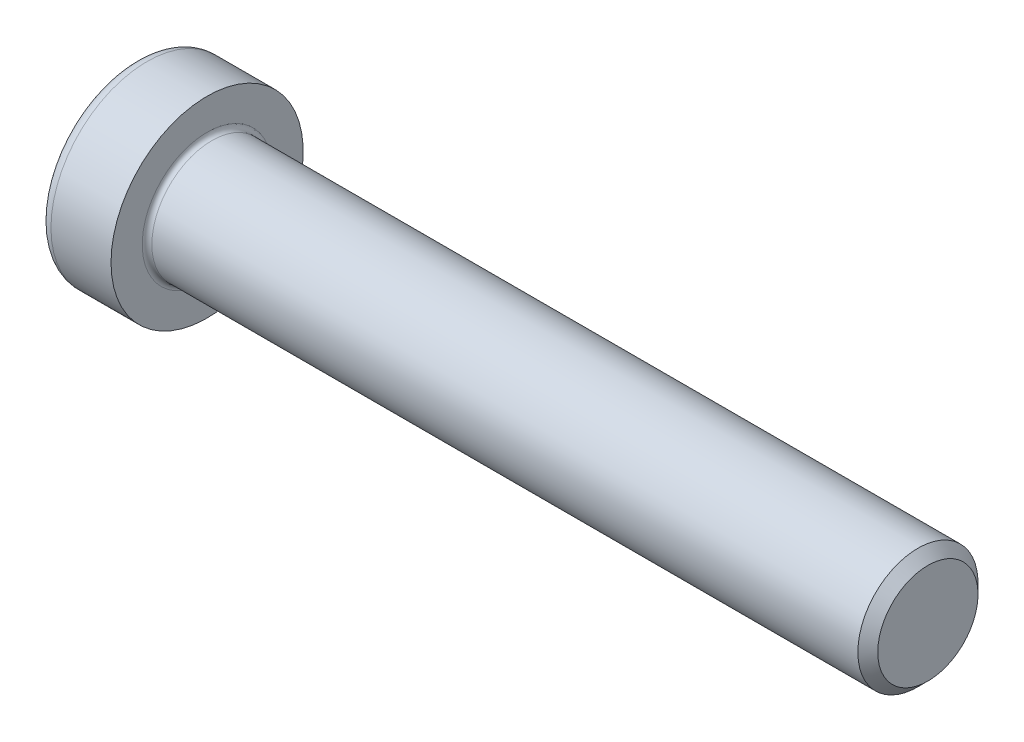
ISO-10303-21;
HEADER;
FILE_DESCRIPTION(('STEP AP214'),'2;1');
FILE_NAME('part.step','',(''),(''),'','','');
FILE_SCHEMA(('AUTOMOTIVE_DESIGN { 1 0 10303 214 1 1 1 1 }'));
ENDSEC;
DATA;
#1=APPLICATION_CONTEXT('core data for automotive mechanical design processes');
#2=APPLICATION_PROTOCOL_DEFINITION('international standard','automotive_design',2000,#1);
#3=PRODUCT_CONTEXT('',#1,'mechanical');
#4=PRODUCT('Part','Part','',(#3));
#5=PRODUCT_RELATED_PRODUCT_CATEGORY('part','',(#4));
#6=PRODUCT_DEFINITION_FORMATION('','',#4);
#7=PRODUCT_DEFINITION_CONTEXT('part definition',#1,'design');
#8=PRODUCT_DEFINITION('design','',#6,#7);
#9=PRODUCT_DEFINITION_SHAPE('','',#8);
#10=(LENGTH_UNIT() NAMED_UNIT(*) SI_UNIT(.MILLI.,.METRE.));
#11=(NAMED_UNIT(*) PLANE_ANGLE_UNIT() SI_UNIT($,.RADIAN.));
#12=(NAMED_UNIT(*) SI_UNIT($,.STERADIAN.) SOLID_ANGLE_UNIT());
#13=UNCERTAINTY_MEASURE_WITH_UNIT(LENGTH_MEASURE(1.E-05),#10,'distance_accuracy_value','');
#14=(GEOMETRIC_REPRESENTATION_CONTEXT(3) GLOBAL_UNCERTAINTY_ASSIGNED_CONTEXT((#13)) GLOBAL_UNIT_ASSIGNED_CONTEXT((#10,
#11,#12)) REPRESENTATION_CONTEXT('',''));
#15=CARTESIAN_POINT('',(0.,0.,0.));
#16=DIRECTION('',(0.,0.,1.));
#17=DIRECTION('',(1.,0.,0.));
#18=AXIS2_PLACEMENT_3D('',#15,#16,#17);
#19=CARTESIAN_POINT('',(0.,0.,0.));
#20=DIRECTION('',(-1.,0.,0.));
#21=DIRECTION('',(0.,0.,1.));
#22=AXIS2_PLACEMENT_3D('',#19,#20,#21);
#23=PLANE('',#22);
#24=DIRECTION('',(0.,-0.499999999999997,0.86602540378444));
#25=VECTOR('',#24,1.);
#26=CARTESIAN_POINT('',(0.,4.04145188432738,0.));
#27=LINE('',#26,#25);
#28=CARTESIAN_POINT('',(0.,4.04145188432738,0.));
#29=VERTEX_POINT('',#28);
#30=CARTESIAN_POINT('',(0.,2.0207259421637,3.49999999999999));
#31=VERTEX_POINT('',#30);
#32=EDGE_CURVE('E302',#29,#31,#27,.T.);
#33=ORIENTED_EDGE('',*,*,#32,.T.);
#34=DIRECTION('',(0.,1.,0.));
#35=VECTOR('',#34,1.);
#36=CARTESIAN_POINT('',(0.,-2.02072594216367,3.5));
#37=LINE('',#36,#35);
#38=CARTESIAN_POINT('',(0.,-2.02072594216367,3.5));
#39=VERTEX_POINT('',#38);
#40=EDGE_CURVE('E143',#39,#31,#37,.T.);
#41=ORIENTED_EDGE('',*,*,#40,.F.);
#42=DIRECTION('',(0.,-0.500000000000001,-0.866025403784438));
#43=VECTOR('',#42,1.);
#44=CARTESIAN_POINT('',(0.,-2.02072594216367,3.5));
#45=LINE('',#44,#43);
#46=CARTESIAN_POINT('',(0.,-4.04145188432737,0.));
#47=VERTEX_POINT('',#46);
#48=EDGE_CURVE('E307',#39,#47,#45,.T.);
#49=ORIENTED_EDGE('',*,*,#48,.T.);
#50=DIRECTION('',(0.,0.499999999999997,-0.86602540378444));
#51=VECTOR('',#50,1.);
#52=CARTESIAN_POINT('',(0.,-4.04145188432737,0.));
#53=LINE('',#52,#51);
#54=CARTESIAN_POINT('',(0.,-2.02072594216369,-3.5));
#55=VERTEX_POINT('',#54);
#56=EDGE_CURVE('E311',#47,#55,#53,.T.);
#57=ORIENTED_EDGE('',*,*,#56,.T.);
#58=DIRECTION('',(0.,-1.,0.));
#59=VECTOR('',#58,1.);
#60=CARTESIAN_POINT('',(0.,2.02072594216369,-3.50000000000001));
#61=LINE('',#60,#59);
#62=CARTESIAN_POINT('',(0.,2.02072594216369,-3.50000000000001));
#63=VERTEX_POINT('',#62);
#64=EDGE_CURVE('E315',#63,#55,#61,.T.);
#65=ORIENTED_EDGE('',*,*,#64,.F.);
#66=DIRECTION('',(0.,-0.500000000000001,-0.866025403784438));
#67=VECTOR('',#66,1.);
#68=CARTESIAN_POINT('',(0.,4.04145188432738,0.));
#69=LINE('',#68,#67);
#70=EDGE_CURVE('E138',#29,#63,#69,.T.);
#71=ORIENTED_EDGE('',*,*,#70,.F.);
#72=EDGE_LOOP('',(#33,#41,#49,#57,#65,#71));
#73=FACE_BOUND('',#72,.T.);
#74=CARTESIAN_POINT('',(0.,0.,0.));
#75=DIRECTION('',(-1.,0.,0.));
#76=DIRECTION('',(0.,0.,1.));
#77=AXIS2_PLACEMENT_3D('',#74,#75,#76);
#78=CIRCLE('',#77,7.);
#79=CARTESIAN_POINT('',(0.,0.,7.));
#80=VERTEX_POINT('',#79);
#81=EDGE_CURVE('E57',#80,#80,#78,.T.);
#82=ORIENTED_EDGE('',*,*,#81,.T.);
#83=EDGE_LOOP('',(#82));
#84=FACE_BOUND('',#83,.T.);
#85=ADVANCED_FACE('F48',(#73,#84),#23,.T.);
#86=CARTESIAN_POINT('',(-31.75,0.,0.));
#87=DIRECTION('',(-1.,0.,0.));
#88=DIRECTION('',(0.,0.,1.));
#89=AXIS2_PLACEMENT_3D('',#86,#87,#88);
#90=CYLINDRICAL_SURFACE('',#89,8.);
#91=CARTESIAN_POINT('',(1.,0.,0.));
#92=DIRECTION('',(-1.,0.,0.));
#93=DIRECTION('',(0.,0.,1.));
#94=AXIS2_PLACEMENT_3D('',#91,#92,#93);
#95=CIRCLE('',#94,8.);
#96=CARTESIAN_POINT('',(1.,0.,8.));
#97=VERTEX_POINT('',#96);
#98=EDGE_CURVE('E11',#97,#97,#95,.F.);
#99=ORIENTED_EDGE('',*,*,#98,.T.);
#100=EDGE_LOOP('',(#99));
#101=FACE_BOUND('',#100,.T.);
#102=CARTESIAN_POINT('',(6.,0.,0.));
#103=DIRECTION('',(-1.,0.,0.));
#104=DIRECTION('',(0.,0.,1.));
#105=AXIS2_PLACEMENT_3D('',#102,#103,#104);
#106=CIRCLE('',#105,8.);
#107=CARTESIAN_POINT('',(6.,0.,8.));
#108=VERTEX_POINT('',#107);
#109=EDGE_CURVE('E168',#108,#108,#106,.T.);
#110=ORIENTED_EDGE('',*,*,#109,.T.);
#111=EDGE_LOOP('',(#110));
#112=FACE_BOUND('',#111,.T.);
#113=ADVANCED_FACE('F198',(#101,#112),#90,.T.);
#114=CARTESIAN_POINT('',(6.,8.,0.));
#115=DIRECTION('',(1.,0.,0.));
#116=DIRECTION('',(0.,0.,-1.));
#117=AXIS2_PLACEMENT_3D('',#114,#115,#116);
#118=PLANE('',#117);
#119=CARTESIAN_POINT('',(6.,0.,0.));
#120=DIRECTION('',(1.,0.,0.));
#121=DIRECTION('',(0.,0.,-1.));
#122=AXIS2_PLACEMENT_3D('',#119,#120,#121);
#123=CIRCLE('',#122,5.4);
#124=CARTESIAN_POINT('',(6.,0.,-5.4));
#125=VERTEX_POINT('',#124);
#126=EDGE_CURVE('E172',#125,#125,#123,.F.);
#127=ORIENTED_EDGE('',*,*,#126,.T.);
#128=EDGE_LOOP('',(#127));
#129=FACE_BOUND('',#128,.T.);
#130=ORIENTED_EDGE('',*,*,#109,.F.);
#131=EDGE_LOOP('',(#130));
#132=FACE_BOUND('',#131,.T.);
#133=ADVANCED_FACE('F203',(#129,#132),#118,.T.);
#134=CARTESIAN_POINT('',(-31.75,0.,0.));
#135=DIRECTION('',(-1.,0.,0.));
#136=DIRECTION('',(0.,0.,1.));
#137=AXIS2_PLACEMENT_3D('',#134,#135,#136);
#138=CYLINDRICAL_SURFACE('',#137,5.);
#139=CARTESIAN_POINT('',(6.4,0.,0.));
#140=DIRECTION('',(1.,0.,0.));
#141=DIRECTION('',(0.,0.,-1.));
#142=AXIS2_PLACEMENT_3D('',#139,#140,#141);
#143=CIRCLE('',#142,5.);
#144=CARTESIAN_POINT('',(6.4,0.,-5.));
#145=VERTEX_POINT('',#144);
#146=EDGE_CURVE('E176',#145,#145,#143,.T.);
#147=ORIENTED_EDGE('',*,*,#146,.T.);
#148=EDGE_LOOP('',(#147));
#149=FACE_BOUND('',#148,.T.);
#150=CARTESIAN_POINT('',(65.172,0.,0.));
#151=DIRECTION('',(-1.,0.,0.));
#152=DIRECTION('',(0.,0.,1.));
#153=AXIS2_PLACEMENT_3D('',#150,#151,#152);
#154=CIRCLE('',#153,5.);
#155=CARTESIAN_POINT('',(65.172,0.,5.));
#156=VERTEX_POINT('',#155);
#157=EDGE_CURVE('E164',#156,#156,#154,.T.);
#158=ORIENTED_EDGE('',*,*,#157,.T.);
#159=EDGE_LOOP('',(#158));
#160=FACE_BOUND('',#159,.T.);
#161=ADVANCED_FACE('F209',(#149,#160),#138,.T.);
#162=CARTESIAN_POINT('',(66.,0.,0.));
#163=DIRECTION('',(-1.,0.,0.));
#164=DIRECTION('',(0.,0.,1.));
#165=AXIS2_PLACEMENT_3D('',#162,#163,#164);
#166=CONICAL_SURFACE('',#165,4.172,0.78539816339745);
#167=ORIENTED_EDGE('',*,*,#157,.F.);
#168=EDGE_LOOP('',(#167));
#169=FACE_BOUND('',#168,.T.);
#170=CARTESIAN_POINT('',(66.,0.,0.));
#171=DIRECTION('',(-1.,0.,0.));
#172=DIRECTION('',(0.,0.,1.));
#173=AXIS2_PLACEMENT_3D('',#170,#171,#172);
#174=CIRCLE('',#173,4.172);
#175=CARTESIAN_POINT('',(66.,0.,4.172));
#176=VERTEX_POINT('',#175);
#177=EDGE_CURVE('E159',#176,#176,#174,.T.);
#178=ORIENTED_EDGE('',*,*,#177,.T.);
#179=EDGE_LOOP('',(#178));
#180=FACE_BOUND('',#179,.T.);
#181=ADVANCED_FACE('F213',(#169,#180),#166,.T.);
#182=CARTESIAN_POINT('',(66.,4.172,0.));
#183=DIRECTION('',(1.,0.,0.));
#184=DIRECTION('',(0.,0.,-1.));
#185=AXIS2_PLACEMENT_3D('',#182,#183,#184);
#186=PLANE('',#185);
#187=ORIENTED_EDGE('',*,*,#177,.F.);
#188=EDGE_LOOP('',(#187));
#189=FACE_BOUND('',#188,.T.);
#190=ADVANCED_FACE('F195',(#189),#186,.T.);
#191=CARTESIAN_POINT('',(6.4,0.,0.));
#192=DIRECTION('',(1.,0.,0.));
#193=DIRECTION('',(0.,0.,-1.));
#194=AXIS2_PLACEMENT_3D('',#191,#192,#193);
#195=TOROIDAL_SURFACE('',#194,5.4,0.4);
#196=ORIENTED_EDGE('',*,*,#146,.F.);
#197=EDGE_LOOP('',(#196));
#198=FACE_BOUND('',#197,.T.);
#199=ORIENTED_EDGE('',*,*,#126,.F.);
#200=EDGE_LOOP('',(#199));
#201=FACE_BOUND('',#200,.T.);
#202=ADVANCED_FACE('F186',(#198,#201),#195,.F.);
#203=CARTESIAN_POINT('',(1.,0.,0.));
#204=DIRECTION('',(-1.,0.,0.));
#205=DIRECTION('',(0.,0.,1.));
#206=AXIS2_PLACEMENT_3D('',#203,#204,#205);
#207=TOROIDAL_SURFACE('',#206,7.,1.);
#208=ORIENTED_EDGE('',*,*,#98,.F.);
#209=EDGE_LOOP('',(#208));
#210=FACE_BOUND('',#209,.T.);
#211=ORIENTED_EDGE('',*,*,#81,.F.);
#212=EDGE_LOOP('',(#211));
#213=FACE_BOUND('',#212,.T.);
#214=ADVANCED_FACE('F50',(#210,#213),#207,.T.);
#215=CARTESIAN_POINT('',(4.5,4.04145188432738,0.));
#216=DIRECTION('',(0.,-0.86602540378444,-0.499999999999997));
#217=DIRECTION('',(0.,0.499999999999997,-0.86602540378444));
#218=AXIS2_PLACEMENT_3D('',#215,#216,#217);
#219=PLANE('',#218);
#220=ORIENTED_EDGE('',*,*,#32,.F.);
#221=DIRECTION('',(-1.,0.,0.));
#222=VECTOR('',#221,1.);
#223=CARTESIAN_POINT('',(4.5,4.04145188432738,0.));
#224=LINE('',#223,#222);
#225=CARTESIAN_POINT('',(4.5,4.04145188432738,0.));
#226=VERTEX_POINT('',#225);
#227=EDGE_CURVE('E301',#226,#29,#224,.T.);
#228=ORIENTED_EDGE('',*,*,#227,.F.);
#229=DIRECTION('',(0.,-0.499999999999997,0.86602540378444));
#230=VECTOR('',#229,1.);
#231=CARTESIAN_POINT('',(4.5,4.04145188432738,0.));
#232=LINE('',#231,#230);
#233=CARTESIAN_POINT('',(4.5,3.03108891324554,1.74999999999999));
#234=VERTEX_POINT('',#233);
#235=EDGE_CURVE('E64',#226,#234,#232,.T.);
#236=ORIENTED_EDGE('',*,*,#235,.T.);
#237=CARTESIAN_POINT('',(4.5,2.0207259421637,3.49999999999999));
#238=VERTEX_POINT('',#237);
#239=EDGE_CURVE('E122',#234,#238,#232,.T.);
#240=ORIENTED_EDGE('',*,*,#239,.T.);
#241=DIRECTION('',(-1.,0.,0.));
#242=VECTOR('',#241,1.);
#243=CARTESIAN_POINT('',(4.5,2.0207259421637,3.49999999999999));
#244=LINE('',#243,#242);
#245=EDGE_CURVE('E135',#238,#31,#244,.T.);
#246=ORIENTED_EDGE('',*,*,#245,.T.);
#247=EDGE_LOOP('',(#220,#228,#236,#240,#246));
#248=FACE_BOUND('',#247,.T.);
#249=ADVANCED_FACE('F134',(#248),#219,.T.);
#250=CARTESIAN_POINT('',(4.5,-2.02072594216367,3.5));
#251=DIRECTION('',(0.,0.,1.));
#252=DIRECTION('',(0.,-1.,0.));
#253=AXIS2_PLACEMENT_3D('',#250,#251,#252);
#254=PLANE('',#253);
#255=ORIENTED_EDGE('',*,*,#40,.T.);
#256=ORIENTED_EDGE('',*,*,#245,.F.);
#257=DIRECTION('',(0.,1.,0.));
#258=VECTOR('',#257,1.);
#259=CARTESIAN_POINT('',(4.5,-2.02072594216367,3.5));
#260=LINE('',#259,#258);
#261=CARTESIAN_POINT('',(4.5,0.,3.49999999999999));
#262=VERTEX_POINT('',#261);
#263=EDGE_CURVE('E120',#262,#238,#260,.T.);
#264=ORIENTED_EDGE('',*,*,#263,.F.);
#265=CARTESIAN_POINT('',(4.5,-2.02072594216367,3.5));
#266=VERTEX_POINT('',#265);
#267=EDGE_CURVE('E131',#266,#262,#260,.T.);
#268=ORIENTED_EDGE('',*,*,#267,.F.);
#269=DIRECTION('',(-1.,0.,0.));
#270=VECTOR('',#269,1.);
#271=CARTESIAN_POINT('',(4.5,-2.02072594216367,3.5));
#272=LINE('',#271,#270);
#273=EDGE_CURVE('E146',#266,#39,#272,.T.);
#274=ORIENTED_EDGE('',*,*,#273,.T.);
#275=EDGE_LOOP('',(#255,#256,#264,#268,#274));
#276=FACE_BOUND('',#275,.T.);
#277=ADVANCED_FACE('F140',(#276),#254,.F.);
#278=CARTESIAN_POINT('',(4.5,-2.02072594216367,3.5));
#279=DIRECTION('',(0.,0.866025403784438,-0.500000000000001));
#280=DIRECTION('',(0.,0.500000000000001,0.866025403784438));
#281=AXIS2_PLACEMENT_3D('',#278,#279,#280);
#282=PLANE('',#281);
#283=ORIENTED_EDGE('',*,*,#48,.F.);
#284=ORIENTED_EDGE('',*,*,#273,.F.);
#285=DIRECTION('',(0.,-0.500000000000001,-0.866025403784438));
#286=VECTOR('',#285,1.);
#287=CARTESIAN_POINT('',(4.5,-2.02072594216367,3.5));
#288=LINE('',#287,#286);
#289=CARTESIAN_POINT('',(4.5,-3.03108891324552,1.75));
#290=VERTEX_POINT('',#289);
#291=EDGE_CURVE('E275',#266,#290,#288,.T.);
#292=ORIENTED_EDGE('',*,*,#291,.T.);
#293=CARTESIAN_POINT('',(4.5,-4.04145188432737,0.));
#294=VERTEX_POINT('',#293);
#295=EDGE_CURVE('E277',#290,#294,#288,.T.);
#296=ORIENTED_EDGE('',*,*,#295,.T.);
#297=DIRECTION('',(-1.,0.,0.));
#298=VECTOR('',#297,1.);
#299=CARTESIAN_POINT('',(4.5,-4.04145188432737,0.));
#300=LINE('',#299,#298);
#301=EDGE_CURVE('E154',#294,#47,#300,.T.);
#302=ORIENTED_EDGE('',*,*,#301,.T.);
#303=EDGE_LOOP('',(#283,#284,#292,#296,#302));
#304=FACE_BOUND('',#303,.T.);
#305=ADVANCED_FACE('F226',(#304),#282,.T.);
#306=CARTESIAN_POINT('',(4.5,-4.04145188432737,0.));
#307=DIRECTION('',(0.,0.86602540378444,0.499999999999997));
#308=DIRECTION('',(0.,-0.499999999999998,0.86602540378444));
#309=AXIS2_PLACEMENT_3D('',#306,#307,#308);
#310=PLANE('',#309);
#311=ORIENTED_EDGE('',*,*,#56,.F.);
#312=ORIENTED_EDGE('',*,*,#301,.F.);
#313=DIRECTION('',(0.,0.499999999999997,-0.86602540378444));
#314=VECTOR('',#313,1.);
#315=CARTESIAN_POINT('',(4.5,-4.04145188432737,0.));
#316=LINE('',#315,#314);
#317=CARTESIAN_POINT('',(4.5,-3.03108891324554,-1.74999999999999));
#318=VERTEX_POINT('',#317);
#319=EDGE_CURVE('E280',#294,#318,#316,.T.);
#320=ORIENTED_EDGE('',*,*,#319,.T.);
#321=CARTESIAN_POINT('',(4.5,-2.02072594216369,-3.5));
#322=VERTEX_POINT('',#321);
#323=EDGE_CURVE('E286',#318,#322,#316,.T.);
#324=ORIENTED_EDGE('',*,*,#323,.T.);
#325=DIRECTION('',(-1.,0.,0.));
#326=VECTOR('',#325,1.);
#327=CARTESIAN_POINT('',(4.5,-2.02072594216369,-3.5));
#328=LINE('',#327,#326);
#329=EDGE_CURVE('E328',#322,#55,#328,.T.);
#330=ORIENTED_EDGE('',*,*,#329,.T.);
#331=EDGE_LOOP('',(#311,#312,#320,#324,#330));
#332=FACE_BOUND('',#331,.T.);
#333=ADVANCED_FACE('F229',(#332),#310,.T.);
#334=CARTESIAN_POINT('',(4.5,2.02072594216369,-3.50000000000001));
#335=DIRECTION('',(0.,0.,-1.));
#336=DIRECTION('',(0.,1.,0.));
#337=AXIS2_PLACEMENT_3D('',#334,#335,#336);
#338=PLANE('',#337);
#339=ORIENTED_EDGE('',*,*,#64,.T.);
#340=ORIENTED_EDGE('',*,*,#329,.F.);
#341=DIRECTION('',(0.,-1.,0.));
#342=VECTOR('',#341,1.);
#343=CARTESIAN_POINT('',(4.5,2.02072594216369,-3.50000000000001));
#344=LINE('',#343,#342);
#345=CARTESIAN_POINT('',(4.5,0.,-3.5));
#346=VERTEX_POINT('',#345);
#347=EDGE_CURVE('E293',#346,#322,#344,.T.);
#348=ORIENTED_EDGE('',*,*,#347,.F.);
#349=CARTESIAN_POINT('',(4.5,2.02072594216369,-3.50000000000001));
#350=VERTEX_POINT('',#349);
#351=EDGE_CURVE('E294',#350,#346,#344,.T.);
#352=ORIENTED_EDGE('',*,*,#351,.F.);
#353=DIRECTION('',(-1.,0.,0.));
#354=VECTOR('',#353,1.);
#355=CARTESIAN_POINT('',(4.5,2.02072594216369,-3.50000000000001));
#356=LINE('',#355,#354);
#357=EDGE_CURVE('E324',#350,#63,#356,.T.);
#358=ORIENTED_EDGE('',*,*,#357,.T.);
#359=EDGE_LOOP('',(#339,#340,#348,#352,#358));
#360=FACE_BOUND('',#359,.T.);
#361=ADVANCED_FACE('F233',(#360),#338,.F.);
#362=CARTESIAN_POINT('',(4.5,4.04145188432738,0.));
#363=DIRECTION('',(0.,0.866025403784438,-0.500000000000001));
#364=DIRECTION('',(0.,0.500000000000001,0.866025403784438));
#365=AXIS2_PLACEMENT_3D('',#362,#363,#364);
#366=PLANE('',#365);
#367=ORIENTED_EDGE('',*,*,#70,.T.);
#368=ORIENTED_EDGE('',*,*,#357,.F.);
#369=DIRECTION('',(0.,-0.500000000000001,-0.866025403784438));
#370=VECTOR('',#369,1.);
#371=CARTESIAN_POINT('',(4.5,4.04145188432738,0.));
#372=LINE('',#371,#370);
#373=CARTESIAN_POINT('',(4.5,3.03108891324554,-1.75000000000001));
#374=VERTEX_POINT('',#373);
#375=EDGE_CURVE('E298',#374,#350,#372,.T.);
#376=ORIENTED_EDGE('',*,*,#375,.F.);
#377=EDGE_CURVE('E265',#226,#374,#372,.T.);
#378=ORIENTED_EDGE('',*,*,#377,.F.);
#379=ORIENTED_EDGE('',*,*,#227,.T.);
#380=EDGE_LOOP('',(#367,#368,#376,#378,#379));
#381=FACE_BOUND('',#380,.T.);
#382=ADVANCED_FACE('F237',(#381),#366,.F.);
#383=CARTESIAN_POINT('',(4.5,2.0207259421637,3.49999999999999));
#384=DIRECTION('',(-1.,0.,0.));
#385=DIRECTION('',(0.,0.,1.));
#386=AXIS2_PLACEMENT_3D('',#383,#384,#385);
#387=PLANE('',#386);
#388=CARTESIAN_POINT('',(4.5,0.,0.));
#389=DIRECTION('',(-1.,0.,0.));
#390=DIRECTION('',(0.,0.,1.));
#391=AXIS2_PLACEMENT_3D('',#388,#389,#390);
#392=CIRCLE('',#391,3.5);
#393=EDGE_CURVE('E145',#290,#262,#392,.T.);
#394=ORIENTED_EDGE('',*,*,#393,.F.);
#395=ORIENTED_EDGE('',*,*,#291,.F.);
#396=ORIENTED_EDGE('',*,*,#267,.T.);
#397=EDGE_LOOP('',(#394,#395,#396));
#398=FACE_BOUND('',#397,.T.);
#399=ADVANCED_FACE('F241',(#398),#387,.T.);
#400=EDGE_CURVE('E152',#318,#290,#392,.T.);
#401=ORIENTED_EDGE('',*,*,#400,.F.);
#402=ORIENTED_EDGE('',*,*,#319,.F.);
#403=ORIENTED_EDGE('',*,*,#295,.F.);
#404=EDGE_LOOP('',(#401,#402,#403));
#405=FACE_BOUND('',#404,.T.);
#406=ADVANCED_FACE('F244',(#405),#387,.T.);
#407=EDGE_CURVE('E347',#346,#318,#392,.T.);
#408=ORIENTED_EDGE('',*,*,#407,.F.);
#409=ORIENTED_EDGE('',*,*,#347,.T.);
#410=ORIENTED_EDGE('',*,*,#323,.F.);
#411=EDGE_LOOP('',(#408,#409,#410));
#412=FACE_BOUND('',#411,.T.);
#413=ADVANCED_FACE('F249',(#412),#387,.T.);
#414=EDGE_CURVE('E269',#374,#346,#392,.T.);
#415=ORIENTED_EDGE('',*,*,#414,.F.);
#416=ORIENTED_EDGE('',*,*,#375,.T.);
#417=ORIENTED_EDGE('',*,*,#351,.T.);
#418=EDGE_LOOP('',(#415,#416,#417));
#419=FACE_BOUND('',#418,.T.);
#420=ADVANCED_FACE('F256',(#419),#387,.T.);
#421=EDGE_CURVE('E160',#234,#374,#392,.T.);
#422=ORIENTED_EDGE('',*,*,#421,.F.);
#423=ORIENTED_EDGE('',*,*,#235,.F.);
#424=ORIENTED_EDGE('',*,*,#377,.T.);
#425=EDGE_LOOP('',(#422,#423,#424));
#426=FACE_BOUND('',#425,.T.);
#427=ADVANCED_FACE('F252',(#426),#387,.T.);
#428=EDGE_CURVE('E125',#262,#234,#392,.T.);
#429=ORIENTED_EDGE('',*,*,#428,.F.);
#430=ORIENTED_EDGE('',*,*,#263,.T.);
#431=ORIENTED_EDGE('',*,*,#239,.F.);
#432=EDGE_LOOP('',(#429,#430,#431));
#433=FACE_BOUND('',#432,.T.);
#434=ADVANCED_FACE('F121',(#433),#387,.T.);
#435=CARTESIAN_POINT('',(4.5,0.,0.));
#436=DIRECTION('',(-1.,0.,0.));
#437=DIRECTION('',(0.,0.,1.));
#438=AXIS2_PLACEMENT_3D('',#435,#436,#437);
#439=CONICAL_SURFACE('',#438,3.5,1.04719755119659);
#440=CARTESIAN_POINT('',(6.52072594216371,0.,0.));
#441=VERTEX_POINT('',#440);
#442=VERTEX_LOOP('',#441);
#443=FACE_BOUND('',#442,.T.);
#444=ORIENTED_EDGE('',*,*,#428,.T.);
#445=ORIENTED_EDGE('',*,*,#421,.T.);
#446=ORIENTED_EDGE('',*,*,#414,.T.);
#447=ORIENTED_EDGE('',*,*,#407,.T.);
#448=ORIENTED_EDGE('',*,*,#400,.T.);
#449=ORIENTED_EDGE('',*,*,#393,.T.);
#450=EDGE_LOOP('',(#444,#445,#446,#447,#448,#449));
#451=FACE_BOUND('',#450,.T.);
#452=ADVANCED_FACE('F221',(#443,#451),#439,.F.);
#453=CLOSED_SHELL('',(#85,#113,#133,#161,#181,#190,#202,#214,#249,#277,#305,#333,#361,#382,#399,
#406,#413,#420,#427,#434,#452));
#454=MANIFOLD_SOLID_BREP('B2',#453);
#455=ADVANCED_BREP_SHAPE_REPRESENTATION('',(#18,#454),#14);
#456=SHAPE_DEFINITION_REPRESENTATION(#9,#455);
ENDSEC;
END-ISO-10303-21;
